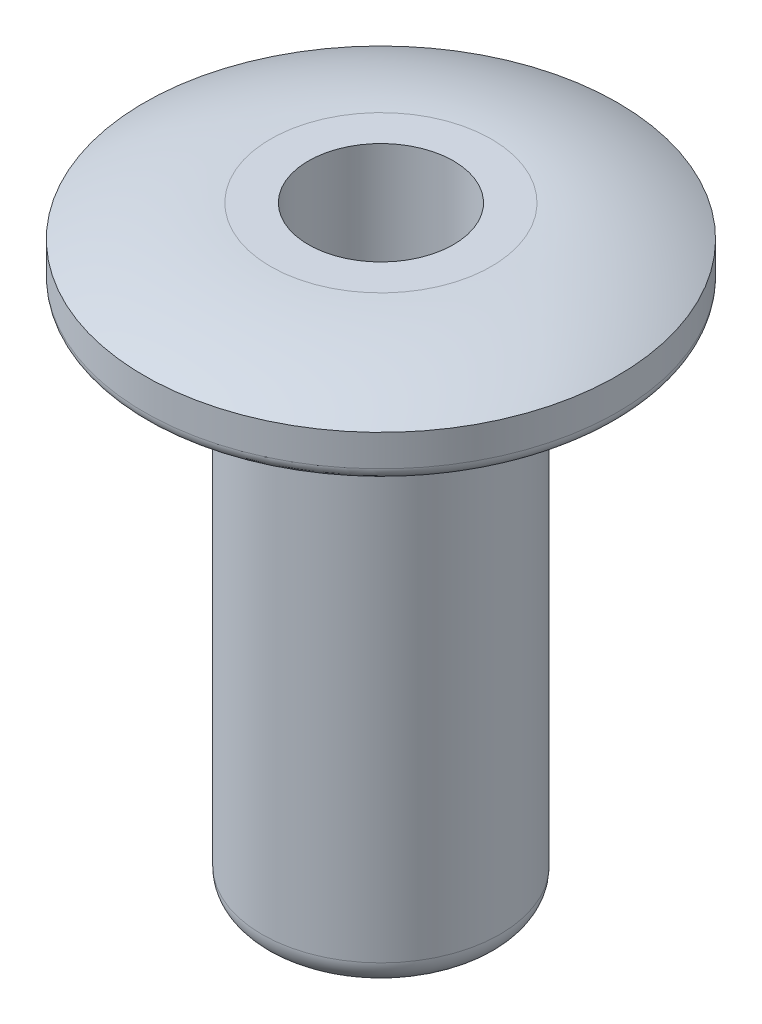
ISO-10303-21;
HEADER;
FILE_DESCRIPTION(('STEP AP214'),'2;1');
FILE_NAME('part.step','',(''),(''),'','','');
FILE_SCHEMA(('AUTOMOTIVE_DESIGN { 1 0 10303 214 1 1 1 1 }'));
ENDSEC;
DATA;
#1=APPLICATION_CONTEXT('core data for automotive mechanical design processes');
#2=APPLICATION_PROTOCOL_DEFINITION('international standard','automotive_design',2000,#1);
#3=PRODUCT_CONTEXT('',#1,'mechanical');
#4=PRODUCT('Part','Part','',(#3));
#5=PRODUCT_RELATED_PRODUCT_CATEGORY('part','',(#4));
#6=PRODUCT_DEFINITION_FORMATION('','',#4);
#7=PRODUCT_DEFINITION_CONTEXT('part definition',#1,'design');
#8=PRODUCT_DEFINITION('design','',#6,#7);
#9=PRODUCT_DEFINITION_SHAPE('','',#8);
#10=(LENGTH_UNIT() NAMED_UNIT(*) SI_UNIT(.MILLI.,.METRE.));
#11=(NAMED_UNIT(*) PLANE_ANGLE_UNIT() SI_UNIT($,.RADIAN.));
#12=(NAMED_UNIT(*) SI_UNIT($,.STERADIAN.) SOLID_ANGLE_UNIT());
#13=UNCERTAINTY_MEASURE_WITH_UNIT(LENGTH_MEASURE(1.E-05),#10,'distance_accuracy_value','');
#14=(GEOMETRIC_REPRESENTATION_CONTEXT(3) GLOBAL_UNCERTAINTY_ASSIGNED_CONTEXT((#13)) GLOBAL_UNIT_ASSIGNED_CONTEXT((#10,
#11,#12)) REPRESENTATION_CONTEXT('',''));
#15=CARTESIAN_POINT('',(0.,0.,0.));
#16=DIRECTION('',(0.,0.,1.));
#17=DIRECTION('',(1.,0.,0.));
#18=AXIS2_PLACEMENT_3D('',#15,#16,#17);
#19=CARTESIAN_POINT('',(-2.39395,0.,0.));
#20=DIRECTION('',(0.,1.,0.));
#21=DIRECTION('',(0.,0.,1.));
#22=AXIS2_PLACEMENT_3D('',#19,#20,#21);
#23=PLANE('',#22);
#24=CARTESIAN_POINT('',(0.,0.,0.));
#25=DIRECTION('',(0.,1.,0.));
#26=DIRECTION('',(0.,0.,1.));
#27=AXIS2_PLACEMENT_3D('',#24,#25,#26);
#28=CIRCLE('',#27,1.88595);
#29=CARTESIAN_POINT('',(0.,0.,1.88595));
#30=VERTEX_POINT('',#29);
#31=EDGE_CURVE('E39',#30,#30,#28,.F.);
#32=ORIENTED_EDGE('',*,*,#31,.T.);
#33=EDGE_LOOP('',(#32));
#34=FACE_BOUND('',#33,.T.);
#35=CARTESIAN_POINT('',(0.,0.,0.));
#36=DIRECTION('',(0.,-1.,0.));
#37=DIRECTION('',(0.,0.,-1.));
#38=AXIS2_PLACEMENT_3D('',#35,#36,#37);
#39=CIRCLE('',#38,1.4605);
#40=CARTESIAN_POINT('',(0.,0.,-1.4605));
#41=VERTEX_POINT('',#40);
#42=EDGE_CURVE('E43',#41,#41,#39,.T.);
#43=ORIENTED_EDGE('',*,*,#42,.F.);
#44=EDGE_LOOP('',(#43));
#45=FACE_BOUND('',#44,.T.);
#46=ADVANCED_FACE('F32',(#34,#45),#23,.F.);
#47=CARTESIAN_POINT('',(0.,0.,0.));
#48=DIRECTION('',(0.,-1.,0.));
#49=DIRECTION('',(0.,0.,-1.));
#50=AXIS2_PLACEMENT_3D('',#47,#48,#49);
#51=CYLINDRICAL_SURFACE('',#50,1.4605);
#52=CARTESIAN_POINT('',(0.,12.065,0.));
#53=DIRECTION('',(0.,-1.,0.));
#54=DIRECTION('',(0.,0.,-1.));
#55=AXIS2_PLACEMENT_3D('',#52,#53,#54);
#56=CIRCLE('',#55,1.4605);
#57=CARTESIAN_POINT('',(0.,12.065,-1.4605));
#58=VERTEX_POINT('',#57);
#59=EDGE_CURVE('E47',#58,#58,#56,.T.);
#60=ORIENTED_EDGE('',*,*,#59,.F.);
#61=EDGE_LOOP('',(#60));
#62=FACE_BOUND('',#61,.T.);
#63=ORIENTED_EDGE('',*,*,#42,.T.);
#64=EDGE_LOOP('',(#63));
#65=FACE_BOUND('',#64,.T.);
#66=ADVANCED_FACE('F97',(#62,#65),#51,.F.);
#67=CARTESIAN_POINT('',(-1.4605,12.065,0.));
#68=DIRECTION('',(0.,-1.,0.));
#69=DIRECTION('',(0.,0.,-1.));
#70=AXIS2_PLACEMENT_3D('',#67,#68,#69);
#71=PLANE('',#70);
#72=CARTESIAN_POINT('',(0.,12.065,0.));
#73=DIRECTION('',(0.,-1.,0.));
#74=DIRECTION('',(0.,0.,-1.));
#75=AXIS2_PLACEMENT_3D('',#72,#73,#74);
#76=CIRCLE('',#75,2.2225);
#77=CARTESIAN_POINT('',(0.,12.065,-2.2225));
#78=VERTEX_POINT('',#77);
#79=EDGE_CURVE('E52',#78,#78,#76,.T.);
#80=ORIENTED_EDGE('',*,*,#79,.F.);
#81=EDGE_LOOP('',(#80));
#82=FACE_BOUND('',#81,.T.);
#83=ORIENTED_EDGE('',*,*,#59,.T.);
#84=EDGE_LOOP('',(#83));
#85=FACE_BOUND('',#84,.T.);
#86=ADVANCED_FACE('F91',(#82,#85),#71,.F.);
#87=CARTESIAN_POINT('',(0.,6.66749999999997,0.));
#88=DIRECTION('',(0.,-1.,0.));
#89=DIRECTION('',(0.,0.,-1.));
#90=AXIS2_PLACEMENT_3D('',#87,#88,#89);
#91=DEGENERATE_TOROIDAL_SURFACE('',#90,2.2225,5.39750000000002,.T.);
#92=CARTESIAN_POINT('',(0.,11.43,0.));
#93=DIRECTION('',(0.,-1.,0.));
#94=DIRECTION('',(0.,0.,-1.));
#95=AXIS2_PLACEMENT_3D('',#92,#93,#94);
#96=CIRCLE('',#95,4.7625);
#97=CARTESIAN_POINT('',(0.,11.43,-4.7625));
#98=VERTEX_POINT('',#97);
#99=EDGE_CURVE('E55',#98,#98,#96,.T.);
#100=ORIENTED_EDGE('',*,*,#99,.F.);
#101=EDGE_LOOP('',(#100));
#102=FACE_BOUND('',#101,.T.);
#103=ORIENTED_EDGE('',*,*,#79,.T.);
#104=EDGE_LOOP('',(#103));
#105=FACE_BOUND('',#104,.T.);
#106=ADVANCED_FACE('F85',(#102,#105),#91,.T.);
#107=CARTESIAN_POINT('',(0.,0.,0.));
#108=DIRECTION('',(0.,-1.,0.));
#109=DIRECTION('',(0.,0.,-1.));
#110=AXIS2_PLACEMENT_3D('',#107,#108,#109);
#111=CYLINDRICAL_SURFACE('',#110,4.7625);
#112=CARTESIAN_POINT('',(0.,10.795,0.));
#113=DIRECTION('',(0.,-1.,0.));
#114=DIRECTION('',(0.,0.,-1.));
#115=AXIS2_PLACEMENT_3D('',#112,#113,#114);
#116=CIRCLE('',#115,4.7625);
#117=CARTESIAN_POINT('',(0.,10.795,-4.7625));
#118=VERTEX_POINT('',#117);
#119=EDGE_CURVE('E58',#118,#118,#116,.T.);
#120=ORIENTED_EDGE('',*,*,#119,.F.);
#121=EDGE_LOOP('',(#120));
#122=FACE_BOUND('',#121,.T.);
#123=ORIENTED_EDGE('',*,*,#99,.T.);
#124=EDGE_LOOP('',(#123));
#125=FACE_BOUND('',#124,.T.);
#126=ADVANCED_FACE('F79',(#122,#125),#111,.T.);
#127=CARTESIAN_POINT('',(0.,10.795,0.));
#128=DIRECTION('',(0.,-1.,0.));
#129=DIRECTION('',(0.,0.,-1.));
#130=AXIS2_PLACEMENT_3D('',#127,#128,#129);
#131=TOROIDAL_SURFACE('',#130,4.5085,0.254000000000002);
#132=CARTESIAN_POINT('',(0.,10.541,0.));
#133=DIRECTION('',(0.,-1.,0.));
#134=DIRECTION('',(0.,0.,-1.));
#135=AXIS2_PLACEMENT_3D('',#132,#133,#134);
#136=CIRCLE('',#135,4.5085);
#137=CARTESIAN_POINT('',(0.,10.541,-4.5085));
#138=VERTEX_POINT('',#137);
#139=EDGE_CURVE('E61',#138,#138,#136,.T.);
#140=ORIENTED_EDGE('',*,*,#139,.F.);
#141=EDGE_LOOP('',(#140));
#142=FACE_BOUND('',#141,.T.);
#143=ORIENTED_EDGE('',*,*,#119,.T.);
#144=EDGE_LOOP('',(#143));
#145=FACE_BOUND('',#144,.T.);
#146=ADVANCED_FACE('F73',(#142,#145),#131,.T.);
#147=CARTESIAN_POINT('',(-4.5085,10.541,0.));
#148=DIRECTION('',(0.,1.,0.));
#149=DIRECTION('',(0.,0.,1.));
#150=AXIS2_PLACEMENT_3D('',#147,#148,#149);
#151=PLANE('',#150);
#152=CARTESIAN_POINT('',(0.,10.541,0.));
#153=DIRECTION('',(0.,-1.,0.));
#154=DIRECTION('',(0.,0.,-1.));
#155=AXIS2_PLACEMENT_3D('',#152,#153,#154);
#156=CIRCLE('',#155,2.39395);
#157=CARTESIAN_POINT('',(0.,10.541,-2.39395));
#158=VERTEX_POINT('',#157);
#159=EDGE_CURVE('E64',#158,#158,#156,.T.);
#160=ORIENTED_EDGE('',*,*,#159,.F.);
#161=EDGE_LOOP('',(#160));
#162=FACE_BOUND('',#161,.T.);
#163=ORIENTED_EDGE('',*,*,#139,.T.);
#164=EDGE_LOOP('',(#163));
#165=FACE_BOUND('',#164,.T.);
#166=ADVANCED_FACE('F70',(#162,#165),#151,.F.);
#167=CARTESIAN_POINT('',(0.,0.,0.));
#168=DIRECTION('',(0.,-1.,0.));
#169=DIRECTION('',(0.,0.,-1.));
#170=AXIS2_PLACEMENT_3D('',#167,#168,#169);
#171=CYLINDRICAL_SURFACE('',#170,2.39395);
#172=CARTESIAN_POINT('',(0.,0.508,0.));
#173=DIRECTION('',(0.,1.,0.));
#174=DIRECTION('',(0.,0.,1.));
#175=AXIS2_PLACEMENT_3D('',#172,#173,#174);
#176=CIRCLE('',#175,2.39395);
#177=CARTESIAN_POINT('',(0.,0.508,2.39395));
#178=VERTEX_POINT('',#177);
#179=EDGE_CURVE('E10',#178,#178,#176,.T.);
#180=ORIENTED_EDGE('',*,*,#179,.T.);
#181=EDGE_LOOP('',(#180));
#182=FACE_BOUND('',#181,.T.);
#183=ORIENTED_EDGE('',*,*,#159,.T.);
#184=EDGE_LOOP('',(#183));
#185=FACE_BOUND('',#184,.T.);
#186=ADVANCED_FACE('F68',(#182,#185),#171,.T.);
#187=CARTESIAN_POINT('',(0.,0.508,0.));
#188=DIRECTION('',(0.,1.,0.));
#189=DIRECTION('',(0.,0.,1.));
#190=AXIS2_PLACEMENT_3D('',#187,#188,#189);
#191=TOROIDAL_SURFACE('',#190,1.88595,0.508);
#192=ORIENTED_EDGE('',*,*,#179,.F.);
#193=EDGE_LOOP('',(#192));
#194=FACE_BOUND('',#193,.T.);
#195=ORIENTED_EDGE('',*,*,#31,.F.);
#196=EDGE_LOOP('',(#195));
#197=FACE_BOUND('',#196,.T.);
#198=ADVANCED_FACE('F34',(#194,#197),#191,.T.);
#199=CLOSED_SHELL('',(#46,#66,#86,#106,#126,#146,#166,#186,#198));
#200=MANIFOLD_SOLID_BREP('B2',#199);
#201=ADVANCED_BREP_SHAPE_REPRESENTATION('',(#18,#200),#14);
#202=SHAPE_DEFINITION_REPRESENTATION(#9,#201);
ENDSEC;
END-ISO-10303-21;
